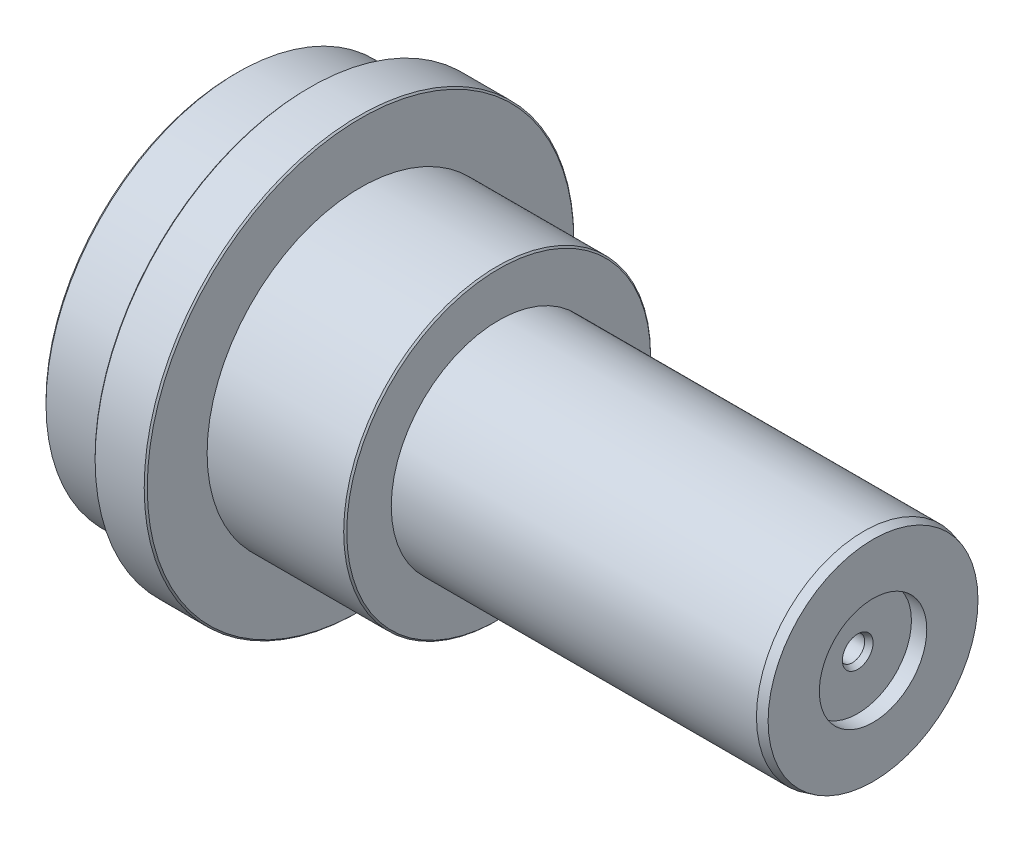
ISO-10303-21;
HEADER;
FILE_DESCRIPTION(('STEP AP214'),'2;1');
FILE_NAME('part.step','',(''),(''),'','','');
FILE_SCHEMA(('AUTOMOTIVE_DESIGN { 1 0 10303 214 1 1 1 1 }'));
ENDSEC;
DATA;
#1=APPLICATION_CONTEXT('core data for automotive mechanical design processes');
#2=APPLICATION_PROTOCOL_DEFINITION('international standard','automotive_design',2000,#1);
#3=PRODUCT_CONTEXT('',#1,'mechanical');
#4=PRODUCT('Part','Part','',(#3));
#5=PRODUCT_RELATED_PRODUCT_CATEGORY('part','',(#4));
#6=PRODUCT_DEFINITION_FORMATION('','',#4);
#7=PRODUCT_DEFINITION_CONTEXT('part definition',#1,'design');
#8=PRODUCT_DEFINITION('design','',#6,#7);
#9=PRODUCT_DEFINITION_SHAPE('','',#8);
#10=(LENGTH_UNIT() NAMED_UNIT(*) SI_UNIT(.MILLI.,.METRE.));
#11=(NAMED_UNIT(*) PLANE_ANGLE_UNIT() SI_UNIT($,.RADIAN.));
#12=(NAMED_UNIT(*) SI_UNIT($,.STERADIAN.) SOLID_ANGLE_UNIT());
#13=UNCERTAINTY_MEASURE_WITH_UNIT(LENGTH_MEASURE(1.E-05),#10,'distance_accuracy_value','');
#14=(GEOMETRIC_REPRESENTATION_CONTEXT(3) GLOBAL_UNCERTAINTY_ASSIGNED_CONTEXT((#13)) GLOBAL_UNIT_ASSIGNED_CONTEXT((#10,
#11,#12)) REPRESENTATION_CONTEXT('',''));
#15=CARTESIAN_POINT('',(0.,0.,0.));
#16=DIRECTION('',(0.,0.,1.));
#17=DIRECTION('',(1.,0.,0.));
#18=AXIS2_PLACEMENT_3D('',#15,#16,#17);
#19=CARTESIAN_POINT('',(41.,0.,0.));
#20=DIRECTION('',(-1.,0.,0.));
#21=DIRECTION('',(0.,0.,1.));
#22=AXIS2_PLACEMENT_3D('',#19,#20,#21);
#23=CYLINDRICAL_SURFACE('',#22,70.);
#24=CARTESIAN_POINT('',(40.4999999995512,0.,0.));
#25=DIRECTION('',(1.,0.,0.));
#26=DIRECTION('',(0.,0.,-1.));
#27=AXIS2_PLACEMENT_3D('',#24,#25,#26);
#28=CIRCLE('',#27,70.);
#29=CARTESIAN_POINT('',(40.4999999995512,0.,-70.));
#30=VERTEX_POINT('',#29);
#31=EDGE_CURVE('E112',#30,#30,#28,.F.);
#32=ORIENTED_EDGE('',*,*,#31,.T.);
#33=EDGE_LOOP('',(#32));
#34=FACE_BOUND('',#33,.T.);
#35=CARTESIAN_POINT('',(24.4999999995513,0.,0.));
#36=DIRECTION('',(-1.,0.,0.));
#37=DIRECTION('',(0.,0.,1.));
#38=AXIS2_PLACEMENT_3D('',#35,#36,#37);
#39=CIRCLE('',#38,70.);
#40=CARTESIAN_POINT('',(24.4999999995513,0.,70.));
#41=VERTEX_POINT('',#40);
#42=EDGE_CURVE('E109',#41,#41,#39,.F.);
#43=ORIENTED_EDGE('',*,*,#42,.T.);
#44=EDGE_LOOP('',(#43));
#45=FACE_BOUND('',#44,.T.);
#46=ADVANCED_FACE('F41',(#34,#45),#23,.T.);
#47=CARTESIAN_POINT('',(41.,70.,0.));
#48=DIRECTION('',(1.,0.,0.));
#49=DIRECTION('',(0.,0.,-1.));
#50=AXIS2_PLACEMENT_3D('',#47,#48,#49);
#51=PLANE('',#50);
#52=CARTESIAN_POINT('',(41.,0.,0.));
#53=DIRECTION('',(1.,0.,0.));
#54=DIRECTION('',(0.,0.,-1.));
#55=AXIS2_PLACEMENT_3D('',#52,#53,#54);
#56=CIRCLE('',#55,69.5000000004487);
#57=CARTESIAN_POINT('',(41.,0.,-69.5000000004487));
#58=VERTEX_POINT('',#57);
#59=EDGE_CURVE('E115',#58,#58,#56,.T.);
#60=ORIENTED_EDGE('',*,*,#59,.T.);
#61=EDGE_LOOP('',(#60));
#62=FACE_BOUND('',#61,.T.);
#63=CARTESIAN_POINT('',(41.,0.,0.));
#64=DIRECTION('',(1.,0.,0.));
#65=DIRECTION('',(0.,0.,-1.));
#66=AXIS2_PLACEMENT_3D('',#63,#64,#65);
#67=CIRCLE('',#66,50.);
#68=CARTESIAN_POINT('',(41.,0.,50.));
#69=VERTEX_POINT('',#68);
#70=EDGE_CURVE('E87',#69,#69,#67,.T.);
#71=ORIENTED_EDGE('',*,*,#70,.F.);
#72=EDGE_LOOP('',(#71));
#73=FACE_BOUND('',#72,.T.);
#74=ADVANCED_FACE('F142',(#62,#73),#51,.T.);
#75=CARTESIAN_POINT('',(24.,0.,0.));
#76=DIRECTION('',(-1.,0.,0.));
#77=DIRECTION('',(0.,0.,1.));
#78=AXIS2_PLACEMENT_3D('',#75,#76,#77);
#79=PLANE('',#78);
#80=CARTESIAN_POINT('',(24.,0.,0.));
#81=DIRECTION('',(-1.,0.,0.));
#82=DIRECTION('',(0.,0.,1.));
#83=AXIS2_PLACEMENT_3D('',#80,#81,#82);
#84=CIRCLE('',#83,69.4999999995512);
#85=CARTESIAN_POINT('',(24.,0.,69.4999999995512));
#86=VERTEX_POINT('',#85);
#87=EDGE_CURVE('E124',#86,#86,#84,.T.);
#88=ORIENTED_EDGE('',*,*,#87,.T.);
#89=EDGE_LOOP('',(#88));
#90=FACE_BOUND('',#89,.T.);
#91=CARTESIAN_POINT('',(24.,0.,0.));
#92=DIRECTION('',(-1.,0.,0.));
#93=DIRECTION('',(0.,0.,1.));
#94=AXIS2_PLACEMENT_3D('',#91,#92,#93);
#95=CIRCLE('',#94,62.5);
#96=CARTESIAN_POINT('',(24.,0.,62.5));
#97=VERTEX_POINT('',#96);
#98=EDGE_CURVE('E82',#97,#97,#95,.T.);
#99=ORIENTED_EDGE('',*,*,#98,.F.);
#100=EDGE_LOOP('',(#99));
#101=FACE_BOUND('',#100,.T.);
#102=ADVANCED_FACE('F148',(#90,#101),#79,.T.);
#103=CARTESIAN_POINT('',(0.,0.,0.));
#104=DIRECTION('',(1.,0.,0.));
#105=DIRECTION('',(0.,0.,-1.));
#106=AXIS2_PLACEMENT_3D('',#103,#104,#105);
#107=CYLINDRICAL_SURFACE('',#106,62.5);
#108=CARTESIAN_POINT('',(0.999999999102629,0.,0.));
#109=DIRECTION('',(-1.,0.,0.));
#110=DIRECTION('',(0.,0.,1.));
#111=AXIS2_PLACEMENT_3D('',#108,#109,#110);
#112=CIRCLE('',#111,62.5);
#113=CARTESIAN_POINT('',(0.999999999102652,0.,62.5));
#114=VERTEX_POINT('',#113);
#115=EDGE_CURVE('E11',#114,#114,#112,.F.);
#116=ORIENTED_EDGE('',*,*,#115,.T.);
#117=EDGE_LOOP('',(#116));
#118=FACE_BOUND('',#117,.T.);
#119=ORIENTED_EDGE('',*,*,#98,.T.);
#120=EDGE_LOOP('',(#119));
#121=FACE_BOUND('',#120,.T.);
#122=ADVANCED_FACE('F224',(#118,#121),#107,.T.);
#123=CARTESIAN_POINT('',(0.,0.,0.));
#124=DIRECTION('',(-1.,0.,0.));
#125=DIRECTION('',(0.,0.,1.));
#126=AXIS2_PLACEMENT_3D('',#123,#124,#125);
#127=PLANE('',#126);
#128=CARTESIAN_POINT('',(0.,0.,0.));
#129=DIRECTION('',(-1.,0.,0.));
#130=DIRECTION('',(0.,0.,1.));
#131=AXIS2_PLACEMENT_3D('',#128,#129,#130);
#132=CIRCLE('',#131,61.4999999991025);
#133=CARTESIAN_POINT('',(0.,0.,61.4999999991025));
#134=VERTEX_POINT('',#133);
#135=EDGE_CURVE('E50',#134,#134,#132,.T.);
#136=ORIENTED_EDGE('',*,*,#135,.T.);
#137=EDGE_LOOP('',(#136));
#138=FACE_BOUND('',#137,.T.);
#139=CARTESIAN_POINT('',(0.,0.,0.));
#140=DIRECTION('',(-1.,0.,0.));
#141=DIRECTION('',(0.,0.,1.));
#142=AXIS2_PLACEMENT_3D('',#139,#140,#141);
#143=CIRCLE('',#142,12.5);
#144=CARTESIAN_POINT('',(0.,0.,12.5));
#145=VERTEX_POINT('',#144);
#146=EDGE_CURVE('E73',#145,#145,#143,.T.);
#147=ORIENTED_EDGE('',*,*,#146,.F.);
#148=EDGE_LOOP('',(#147));
#149=FACE_BOUND('',#148,.T.);
#150=ADVANCED_FACE('F129',(#138,#149),#127,.T.);
#151=CARTESIAN_POINT('',(86.,0.,0.));
#152=DIRECTION('',(-1.,0.,0.));
#153=DIRECTION('',(0.,0.,1.));
#154=AXIS2_PLACEMENT_3D('',#151,#152,#153);
#155=CYLINDRICAL_SURFACE('',#154,50.);
#156=CARTESIAN_POINT('',(85.5000000004489,0.,0.));
#157=DIRECTION('',(1.,0.,0.));
#158=DIRECTION('',(0.,0.,-1.));
#159=AXIS2_PLACEMENT_3D('',#156,#157,#158);
#160=CIRCLE('',#159,50.);
#161=CARTESIAN_POINT('',(85.5000000004489,0.,50.));
#162=VERTEX_POINT('',#161);
#163=EDGE_CURVE('E121',#162,#162,#160,.F.);
#164=CARTESIAN_POINT('',(85.5000000004489,0.,50.));
#165=CARTESIAN_POINT('',(85.0364583337776,0.,50.));
#166=CARTESIAN_POINT('',(84.5729166671062,0.,50.));
#167=CARTESIAN_POINT('',(83.6458333337635,0.,50.));
#168=CARTESIAN_POINT('',(83.1822916670922,0.,50.));
#169=CARTESIAN_POINT('',(82.2552083337495,0.,50.));
#170=CARTESIAN_POINT('',(81.7916666670782,0.,50.));
#171=CARTESIAN_POINT('',(80.8645833337355,0.,50.));
#172=CARTESIAN_POINT('',(80.4010416670641,0.,50.));
#173=CARTESIAN_POINT('',(79.4739583337214,0.,50.));
#174=CARTESIAN_POINT('',(79.0104166670501,0.,50.));
#175=CARTESIAN_POINT('',(78.0833333337074,0.,50.));
#176=CARTESIAN_POINT('',(77.6197916670361,0.,50.));
#177=CARTESIAN_POINT('',(76.6927083336934,0.,50.));
#178=CARTESIAN_POINT('',(76.229166667022,0.,50.));
#179=CARTESIAN_POINT('',(75.3020833336793,0.,50.));
#180=CARTESIAN_POINT('',(74.838541667008,0.,50.));
#181=CARTESIAN_POINT('',(73.9114583336653,0.,50.));
#182=CARTESIAN_POINT('',(73.447916666994,0.,50.));
#183=CARTESIAN_POINT('',(72.5208333336513,0.,50.));
#184=CARTESIAN_POINT('',(72.0572916669799,0.,50.));
#185=CARTESIAN_POINT('',(71.1302083336373,0.,50.));
#186=CARTESIAN_POINT('',(70.6666666669659,0.,50.));
#187=CARTESIAN_POINT('',(69.7395833336232,0.,50.));
#188=CARTESIAN_POINT('',(69.2760416669519,0.,50.));
#189=CARTESIAN_POINT('',(68.3489583336092,0.,50.));
#190=CARTESIAN_POINT('',(67.8854166669379,0.,50.));
#191=CARTESIAN_POINT('',(66.9583333335952,0.,50.));
#192=CARTESIAN_POINT('',(66.4947916669238,0.,50.));
#193=CARTESIAN_POINT('',(65.5677083335812,0.,50.));
#194=CARTESIAN_POINT('',(65.1041666669098,0.,50.));
#195=CARTESIAN_POINT('',(64.1770833335671,0.,50.));
#196=CARTESIAN_POINT('',(63.7135416668958,0.,50.));
#197=CARTESIAN_POINT('',(62.7864583335531,0.,50.));
#198=CARTESIAN_POINT('',(62.3229166668818,0.,50.));
#199=CARTESIAN_POINT('',(61.3958333335391,0.,50.));
#200=CARTESIAN_POINT('',(60.9322916668677,0.,50.));
#201=CARTESIAN_POINT('',(60.0052083335251,0.,50.));
#202=CARTESIAN_POINT('',(59.5416666668537,0.,50.));
#203=CARTESIAN_POINT('',(58.614583333511,0.,50.));
#204=CARTESIAN_POINT('',(58.1510416668397,0.,50.));
#205=CARTESIAN_POINT('',(57.223958333497,0.,50.));
#206=CARTESIAN_POINT('',(56.7604166668257,0.,50.));
#207=CARTESIAN_POINT('',(55.833333333483,0.,50.));
#208=CARTESIAN_POINT('',(55.3697916668116,0.,50.));
#209=CARTESIAN_POINT('',(54.4427083334689,0.,50.));
#210=CARTESIAN_POINT('',(53.9791666667976,0.,50.));
#211=CARTESIAN_POINT('',(53.0520833334549,0.,50.));
#212=CARTESIAN_POINT('',(52.5885416667836,0.,50.));
#213=CARTESIAN_POINT('',(51.6614583334409,0.,50.));
#214=CARTESIAN_POINT('',(51.1979166667696,0.,50.));
#215=CARTESIAN_POINT('',(50.2708333334269,0.,50.));
#216=CARTESIAN_POINT('',(49.8072916667555,0.,50.));
#217=CARTESIAN_POINT('',(48.8802083334128,0.,50.));
#218=CARTESIAN_POINT('',(48.4166666667415,0.,50.));
#219=CARTESIAN_POINT('',(47.4895833333988,0.,50.));
#220=CARTESIAN_POINT('',(47.0260416667275,0.,50.));
#221=CARTESIAN_POINT('',(46.0989583333848,0.,50.));
#222=CARTESIAN_POINT('',(45.6354166667134,0.,50.));
#223=CARTESIAN_POINT('',(44.7083333333708,0.,50.));
#224=CARTESIAN_POINT('',(44.2447916666994,0.,50.));
#225=CARTESIAN_POINT('',(43.3177083333567,0.,50.));
#226=CARTESIAN_POINT('',(42.8541666666854,0.,50.));
#227=CARTESIAN_POINT('',(41.9270833333427,0.,50.));
#228=CARTESIAN_POINT('',(41.4635416666714,0.,50.));
#229=CARTESIAN_POINT('',(41.,0.,50.));
#230=B_SPLINE_CURVE_WITH_KNOTS('',3,(#164,#165,#166,#167,#168,#169,#170,#171,#172,#173,#174,
#175,#176,#177,#178,#179,#180,#181,#182,#183,#184,#185,#186,#187,#188,#189,#190,#191,#192,#193,
#194,#195,#196,#197,#198,#199,#200,#201,#202,#203,#204,#205,#206,#207,#208,#209,#210,#211,#212,
#213,#214,#215,#216,#217,#218,#219,#220,#221,#222,#223,#224,#225,#226,#227,#228,#229),
.UNSPECIFIED.,.F.,.F.,(4,2,2,2,2,2,2,2,2,2,2,2,2,2,2,2,2,2,2,2,2,2,2,2,2,2,2,2,2,2,2,2,4),(0.,
1.39062500001404,2.78125000002806,4.17187500004208,5.56250000005612,6.95312500007014,
8.34375000008417,9.7343750000982,11.1250000001122,12.5156250001262,13.9062500001403,
15.2968750001543,16.6875000001683,18.0781250001824,19.4687500001964,20.8593750002104,
22.2500000002244,23.6406250002385,25.0312500002525,26.4218750002665,27.8125000002806,
29.2031250002946,30.5937500003086,31.9843750003226,33.3750000003367,34.7656250003507,
36.1562500003647,37.5468750003787,38.9375000003928,40.3281250004068,41.7187500004208,
43.1093750004349,44.5000000004489),.UNSPECIFIED.);
#231=EDGE_CURVE('BSEAM203',#162,#69,#230,.T.);
#232=ORIENTED_EDGE('',*,*,#163,.T.);
#233=ORIENTED_EDGE('',*,*,#70,.T.);
#234=ORIENTED_EDGE('',*,*,#231,.T.);
#235=ORIENTED_EDGE('',*,*,#231,.F.);
#236=EDGE_LOOP('',(#232,#234,#233,#235));
#237=FACE_BOUND('',#236,.T.);
#238=ADVANCED_FACE('F203',(#237),#155,.T.);
#239=CARTESIAN_POINT('',(86.,0.,0.));
#240=DIRECTION('',(1.,0.,0.));
#241=DIRECTION('',(0.,0.,-1.));
#242=AXIS2_PLACEMENT_3D('',#239,#240,#241);
#243=PLANE('',#242);
#244=CARTESIAN_POINT('',(86.,0.,0.));
#245=DIRECTION('',(1.,0.,0.));
#246=DIRECTION('',(0.,0.,-1.));
#247=AXIS2_PLACEMENT_3D('',#244,#245,#246);
#248=CIRCLE('',#247,49.4999999995514);
#249=CARTESIAN_POINT('',(86.,0.,-49.4999999995514));
#250=VERTEX_POINT('',#249);
#251=EDGE_CURVE('E118',#250,#250,#248,.T.);
#252=ORIENTED_EDGE('',*,*,#251,.T.);
#253=EDGE_LOOP('',(#252));
#254=FACE_BOUND('',#253,.T.);
#255=CARTESIAN_POINT('',(86.,0.,0.));
#256=DIRECTION('',(1.,0.,0.));
#257=DIRECTION('',(0.,0.,-1.));
#258=AXIS2_PLACEMENT_3D('',#255,#256,#257);
#259=CIRCLE('',#258,35.);
#260=CARTESIAN_POINT('',(86.,0.,35.));
#261=VERTEX_POINT('',#260);
#262=EDGE_CURVE('E83',#261,#261,#259,.T.);
#263=ORIENTED_EDGE('',*,*,#262,.F.);
#264=EDGE_LOOP('',(#263));
#265=FACE_BOUND('',#264,.T.);
#266=ADVANCED_FACE('F199',(#254,#265),#243,.T.);
#267=CARTESIAN_POINT('',(208.,0.,0.));
#268=DIRECTION('',(-1.,0.,0.));
#269=DIRECTION('',(0.,0.,1.));
#270=AXIS2_PLACEMENT_3D('',#267,#268,#269);
#271=CYLINDRICAL_SURFACE('',#270,35.);
#272=CARTESIAN_POINT('',(204.999999999758,0.,0.));
#273=DIRECTION('',(1.,0.,0.));
#274=DIRECTION('',(0.,0.,-1.));
#275=AXIS2_PLACEMENT_3D('',#272,#273,#274);
#276=CIRCLE('',#275,35.);
#277=CARTESIAN_POINT('',(204.999999999759,0.,35.));
#278=VERTEX_POINT('',#277);
#279=EDGE_CURVE('E94',#278,#278,#276,.F.);
#280=CARTESIAN_POINT('',(204.999999999759,0.,35.));
#281=CARTESIAN_POINT('',(203.760416666428,0.,35.));
#282=CARTESIAN_POINT('',(202.520833333097,0.,35.));
#283=CARTESIAN_POINT('',(200.041666666435,0.,35.));
#284=CARTESIAN_POINT('',(198.802083333104,0.,35.));
#285=CARTESIAN_POINT('',(196.322916666443,0.,35.));
#286=CARTESIAN_POINT('',(195.083333333112,0.,35.));
#287=CARTESIAN_POINT('',(192.60416666645,0.,35.));
#288=CARTESIAN_POINT('',(191.364583333119,0.,35.));
#289=CARTESIAN_POINT('',(188.885416666458,0.,35.));
#290=CARTESIAN_POINT('',(187.645833333127,0.,35.));
#291=CARTESIAN_POINT('',(185.166666666465,0.,35.));
#292=CARTESIAN_POINT('',(183.927083333135,0.,35.));
#293=CARTESIAN_POINT('',(181.447916666473,0.,35.));
#294=CARTESIAN_POINT('',(180.208333333142,0.,35.));
#295=CARTESIAN_POINT('',(177.72916666648,0.,35.));
#296=CARTESIAN_POINT('',(176.48958333315,0.,35.));
#297=CARTESIAN_POINT('',(174.010416666488,0.,35.));
#298=CARTESIAN_POINT('',(172.770833333157,0.,35.));
#299=CARTESIAN_POINT('',(170.291666666496,0.,35.));
#300=CARTESIAN_POINT('',(169.052083333165,0.,35.));
#301=CARTESIAN_POINT('',(166.572916666503,0.,35.));
#302=CARTESIAN_POINT('',(165.333333333172,0.,35.));
#303=CARTESIAN_POINT('',(162.854166666511,0.,35.));
#304=CARTESIAN_POINT('',(161.61458333318,0.,35.));
#305=CARTESIAN_POINT('',(159.135416666518,0.,35.));
#306=CARTESIAN_POINT('',(157.895833333187,0.,35.));
#307=CARTESIAN_POINT('',(155.416666666526,0.,35.));
#308=CARTESIAN_POINT('',(154.177083333195,0.,35.));
#309=CARTESIAN_POINT('',(151.697916666533,0.,35.));
#310=CARTESIAN_POINT('',(150.458333333203,0.,35.));
#311=CARTESIAN_POINT('',(147.979166666541,0.,35.));
#312=CARTESIAN_POINT('',(146.73958333321,0.,35.));
#313=CARTESIAN_POINT('',(144.260416666548,0.,35.));
#314=CARTESIAN_POINT('',(143.020833333218,0.,35.));
#315=CARTESIAN_POINT('',(140.541666666556,0.,35.));
#316=CARTESIAN_POINT('',(139.302083333225,0.,35.));
#317=CARTESIAN_POINT('',(136.822916666564,0.,35.));
#318=CARTESIAN_POINT('',(135.583333333233,0.,35.));
#319=CARTESIAN_POINT('',(133.104166666571,0.,35.));
#320=CARTESIAN_POINT('',(131.86458333324,0.,35.));
#321=CARTESIAN_POINT('',(129.385416666579,0.,35.));
#322=CARTESIAN_POINT('',(128.145833333248,0.,35.));
#323=CARTESIAN_POINT('',(125.666666666586,0.,35.));
#324=CARTESIAN_POINT('',(124.427083333255,0.,35.));
#325=CARTESIAN_POINT('',(121.947916666594,0.,35.));
#326=CARTESIAN_POINT('',(120.708333333263,0.,35.));
#327=CARTESIAN_POINT('',(118.229166666601,0.,35.));
#328=CARTESIAN_POINT('',(116.98958333327,0.,35.));
#329=CARTESIAN_POINT('',(114.510416666609,0.,35.));
#330=CARTESIAN_POINT('',(113.270833333278,0.,35.));
#331=CARTESIAN_POINT('',(110.791666666616,0.,35.));
#332=CARTESIAN_POINT('',(109.552083333286,0.,35.));
#333=CARTESIAN_POINT('',(107.072916666624,0.,35.));
#334=CARTESIAN_POINT('',(105.833333333293,0.,35.));
#335=CARTESIAN_POINT('',(103.354166666631,0.,35.));
#336=CARTESIAN_POINT('',(102.114583333301,0.,35.));
#337=CARTESIAN_POINT('',(99.635416666639,0.,35.));
#338=CARTESIAN_POINT('',(98.3958333333082,0.,35.));
#339=CARTESIAN_POINT('',(95.9166666666465,0.,35.));
#340=CARTESIAN_POINT('',(94.6770833333157,0.,35.));
#341=CARTESIAN_POINT('',(92.1979166666541,0.,35.));
#342=CARTESIAN_POINT('',(90.9583333333233,0.,35.));
#343=CARTESIAN_POINT('',(88.4791666666616,0.,35.));
#344=CARTESIAN_POINT('',(87.2395833333308,0.,35.));
#345=CARTESIAN_POINT('',(86.,0.,35.));
#346=B_SPLINE_CURVE_WITH_KNOTS('',3,(#280,#281,#282,#283,#284,#285,#286,#287,#288,#289,#290,
#291,#292,#293,#294,#295,#296,#297,#298,#299,#300,#301,#302,#303,#304,#305,#306,#307,#308,#309,
#310,#311,#312,#313,#314,#315,#316,#317,#318,#319,#320,#321,#322,#323,#324,#325,#326,#327,#328,
#329,#330,#331,#332,#333,#334,#335,#336,#337,#338,#339,#340,#341,#342,#343,#344,#345),
.UNSPECIFIED.,.F.,.F.,(4,2,2,2,2,2,2,2,2,2,2,2,2,2,2,2,2,2,2,2,2,2,2,2,2,2,2,2,2,2,2,2,4),(0.,
3.71874999999247,7.43749999998491,11.1562499999774,14.8749999999698,18.5937499999623,
22.3124999999547,26.0312499999472,29.7499999999396,33.4687499999321,37.1874999999245,
40.906249999917,44.6249999999095,48.3437499999019,52.0624999998943,55.7812499998868,
59.4999999998792,63.2187499998717,66.9374999998642,70.6562499998566,74.3749999998491,
78.0937499998415,81.812499999834,85.5312499998264,89.2499999998189,92.9687499998113,
96.6874999998038,100.406249999796,104.124999999789,107.843749999781,111.562499999774,
115.281249999766,118.999999999759),.UNSPECIFIED.);
#347=EDGE_CURVE('BSEAM202',#278,#261,#346,.T.);
#348=ORIENTED_EDGE('',*,*,#279,.T.);
#349=ORIENTED_EDGE('',*,*,#262,.T.);
#350=ORIENTED_EDGE('',*,*,#347,.T.);
#351=ORIENTED_EDGE('',*,*,#347,.F.);
#352=EDGE_LOOP('',(#348,#350,#349,#351));
#353=FACE_BOUND('',#352,.T.);
#354=ADVANCED_FACE('F202',(#353),#271,.T.);
#355=CARTESIAN_POINT('',(208.,0.,0.));
#356=DIRECTION('',(1.,0.,0.));
#357=DIRECTION('',(0.,0.,-1.));
#358=AXIS2_PLACEMENT_3D('',#355,#356,#357);
#359=PLANE('',#358);
#360=CARTESIAN_POINT('',(208.,0.,0.));
#361=DIRECTION('',(1.,0.,0.));
#362=DIRECTION('',(0.,0.,-1.));
#363=AXIS2_PLACEMENT_3D('',#360,#361,#362);
#364=CIRCLE('',#363,34.1961524236038);
#365=CARTESIAN_POINT('',(208.,0.,-34.1961524236038));
#366=VERTEX_POINT('',#365);
#367=EDGE_CURVE('E86',#366,#366,#364,.T.);
#368=ORIENTED_EDGE('',*,*,#367,.T.);
#369=EDGE_LOOP('',(#368));
#370=FACE_BOUND('',#369,.T.);
#371=CARTESIAN_POINT('',(208.,0.,0.));
#372=DIRECTION('',(1.,0.,0.));
#373=DIRECTION('',(0.,0.,-1.));
#374=AXIS2_PLACEMENT_3D('',#371,#372,#373);
#375=CIRCLE('',#374,17.5);
#376=CARTESIAN_POINT('',(208.,0.,-17.5));
#377=VERTEX_POINT('',#376);
#378=EDGE_CURVE('E66',#377,#377,#375,.T.);
#379=ORIENTED_EDGE('',*,*,#378,.F.);
#380=EDGE_LOOP('',(#379));
#381=FACE_BOUND('',#380,.T.);
#382=ADVANCED_FACE('F208',(#370,#381),#359,.T.);
#383=CARTESIAN_POINT('',(193.,0.,0.));
#384=DIRECTION('',(1.,0.,0.));
#385=DIRECTION('',(0.,0.,-1.));
#386=AXIS2_PLACEMENT_3D('',#383,#384,#385);
#387=CONICAL_SURFACE('',#386,4.,1.02974425749014);
#388=CARTESIAN_POINT('',(190.59655751743,0.,0.));
#389=VERTEX_POINT('',#388);
#390=VERTEX_LOOP('',#389);
#391=FACE_BOUND('',#390,.T.);
#392=CARTESIAN_POINT('',(193.,0.,0.));
#393=DIRECTION('',(1.,0.,0.));
#394=DIRECTION('',(0.,0.,-1.));
#395=AXIS2_PLACEMENT_3D('',#392,#393,#394);
#396=CIRCLE('',#395,4.);
#397=CARTESIAN_POINT('',(193.,0.,-3.99999999999999));
#398=VERTEX_POINT('',#397);
#399=EDGE_CURVE('E79',#398,#398,#396,.T.);
#400=ORIENTED_EDGE('',*,*,#399,.T.);
#401=EDGE_LOOP('',(#400));
#402=FACE_BOUND('',#401,.T.);
#403=ADVANCED_FACE('F214',(#391,#402),#387,.F.);
#404=CARTESIAN_POINT('',(208.,0.,0.));
#405=DIRECTION('',(1.,0.,0.));
#406=DIRECTION('',(0.,0.,-1.));
#407=AXIS2_PLACEMENT_3D('',#404,#405,#406);
#408=CYLINDRICAL_SURFACE('',#407,4.);
#409=CARTESIAN_POINT('',(201.26794919187,0.,0.));
#410=DIRECTION('',(-1.,0.,0.));
#411=DIRECTION('',(0.,0.,1.));
#412=AXIS2_PLACEMENT_3D('',#409,#410,#411);
#413=CIRCLE('',#412,4.);
#414=CARTESIAN_POINT('',(201.26794919187,0.,4.));
#415=VERTEX_POINT('',#414);
#416=EDGE_CURVE('E103',#415,#415,#413,.F.);
#417=ORIENTED_EDGE('',*,*,#416,.T.);
#418=EDGE_LOOP('',(#417));
#419=FACE_BOUND('',#418,.T.);
#420=ORIENTED_EDGE('',*,*,#399,.F.);
#421=EDGE_LOOP('',(#420));
#422=FACE_BOUND('',#421,.T.);
#423=ADVANCED_FACE('F332',(#419,#422),#408,.F.);
#424=CARTESIAN_POINT('',(203.,4.,0.));
#425=DIRECTION('',(-1.,0.,0.));
#426=DIRECTION('',(0.,0.,1.));
#427=AXIS2_PLACEMENT_3D('',#424,#425,#426);
#428=PLANE('',#427);
#429=CARTESIAN_POINT('',(203.,0.,0.));
#430=DIRECTION('',(-1.,0.,0.));
#431=DIRECTION('',(0.,0.,1.));
#432=AXIS2_PLACEMENT_3D('',#429,#430,#431);
#433=CIRCLE('',#432,4.99999999895334);
#434=CARTESIAN_POINT('',(203.,0.,4.99999999895335));
#435=VERTEX_POINT('',#434);
#436=EDGE_CURVE('E106',#435,#435,#433,.T.);
#437=ORIENTED_EDGE('',*,*,#436,.T.);
#438=EDGE_LOOP('',(#437));
#439=FACE_BOUND('',#438,.T.);
#440=CARTESIAN_POINT('',(203.,0.,0.));
#441=DIRECTION('',(1.,0.,0.));
#442=DIRECTION('',(0.,0.,-1.));
#443=AXIS2_PLACEMENT_3D('',#440,#441,#442);
#444=CIRCLE('',#443,17.5);
#445=CARTESIAN_POINT('',(203.,0.,-17.5));
#446=VERTEX_POINT('',#445);
#447=EDGE_CURVE('E70',#446,#446,#444,.T.);
#448=ORIENTED_EDGE('',*,*,#447,.T.);
#449=EDGE_LOOP('',(#448));
#450=FACE_BOUND('',#449,.T.);
#451=ADVANCED_FACE('F324',(#439,#450),#428,.F.);
#452=CARTESIAN_POINT('',(208.,0.,0.));
#453=DIRECTION('',(1.,0.,0.));
#454=DIRECTION('',(0.,0.,-1.));
#455=AXIS2_PLACEMENT_3D('',#452,#453,#454);
#456=CYLINDRICAL_SURFACE('',#455,17.5);
#457=ORIENTED_EDGE('',*,*,#447,.F.);
#458=EDGE_LOOP('',(#457));
#459=FACE_BOUND('',#458,.T.);
#460=ORIENTED_EDGE('',*,*,#378,.T.);
#461=EDGE_LOOP('',(#460));
#462=FACE_BOUND('',#461,.T.);
#463=ADVANCED_FACE('F60',(#459,#462),#456,.F.);
#464=CARTESIAN_POINT('',(12.,0.,0.));
#465=DIRECTION('',(-1.,0.,0.));
#466=DIRECTION('',(0.,0.,1.));
#467=AXIS2_PLACEMENT_3D('',#464,#465,#466);
#468=CONICAL_SURFACE('',#467,4.,1.02974425748804);
#469=CARTESIAN_POINT('',(14.4034424825812,0.,0.));
#470=VERTEX_POINT('',#469);
#471=VERTEX_LOOP('',#470);
#472=FACE_BOUND('',#471,.T.);
#473=CARTESIAN_POINT('',(12.,0.,0.));
#474=DIRECTION('',(-1.,0.,0.));
#475=DIRECTION('',(0.,0.,1.));
#476=AXIS2_PLACEMENT_3D('',#473,#474,#475);
#477=CIRCLE('',#476,4.);
#478=CARTESIAN_POINT('',(12.,0.,4.));
#479=VERTEX_POINT('',#478);
#480=EDGE_CURVE('E64',#479,#479,#477,.T.);
#481=ORIENTED_EDGE('',*,*,#480,.T.);
#482=EDGE_LOOP('',(#481));
#483=FACE_BOUND('',#482,.T.);
#484=ADVANCED_FACE('F56',(#472,#483),#468,.F.);
#485=CARTESIAN_POINT('',(0.,0.,0.));
#486=DIRECTION('',(-1.,0.,0.));
#487=DIRECTION('',(0.,0.,1.));
#488=AXIS2_PLACEMENT_3D('',#485,#486,#487);
#489=CYLINDRICAL_SURFACE('',#488,4.);
#490=CARTESIAN_POINT('',(3.73205080812997,0.,0.));
#491=DIRECTION('',(1.,0.,0.));
#492=DIRECTION('',(0.,0.,-1.));
#493=AXIS2_PLACEMENT_3D('',#490,#491,#492);
#494=CIRCLE('',#493,4.);
#495=CARTESIAN_POINT('',(3.73205080812996,0.,-4.));
#496=VERTEX_POINT('',#495);
#497=EDGE_CURVE('E97',#496,#496,#494,.F.);
#498=ORIENTED_EDGE('',*,*,#497,.T.);
#499=EDGE_LOOP('',(#498));
#500=FACE_BOUND('',#499,.T.);
#501=ORIENTED_EDGE('',*,*,#480,.F.);
#502=EDGE_LOOP('',(#501));
#503=FACE_BOUND('',#502,.T.);
#504=ADVANCED_FACE('F59',(#500,#503),#489,.F.);
#505=CARTESIAN_POINT('',(2.00000000000001,4.,0.));
#506=DIRECTION('',(1.,0.,0.));
#507=DIRECTION('',(0.,0.,-1.));
#508=AXIS2_PLACEMENT_3D('',#505,#506,#507);
#509=PLANE('',#508);
#510=CARTESIAN_POINT('',(2.00000000000001,0.,0.));
#511=DIRECTION('',(1.,0.,0.));
#512=DIRECTION('',(0.,0.,-1.));
#513=AXIS2_PLACEMENT_3D('',#510,#511,#512);
#514=CIRCLE('',#513,4.99999999895329);
#515=CARTESIAN_POINT('',(2.,0.,-4.99999999895329));
#516=VERTEX_POINT('',#515);
#517=EDGE_CURVE('E100',#516,#516,#514,.T.);
#518=ORIENTED_EDGE('',*,*,#517,.T.);
#519=EDGE_LOOP('',(#518));
#520=FACE_BOUND('',#519,.T.);
#521=CARTESIAN_POINT('',(2.,0.,0.));
#522=DIRECTION('',(-1.,0.,0.));
#523=DIRECTION('',(0.,0.,1.));
#524=AXIS2_PLACEMENT_3D('',#521,#522,#523);
#525=CIRCLE('',#524,12.5);
#526=CARTESIAN_POINT('',(2.00000000000001,0.,12.5));
#527=VERTEX_POINT('',#526);
#528=EDGE_CURVE('E67',#527,#527,#525,.T.);
#529=ORIENTED_EDGE('',*,*,#528,.T.);
#530=EDGE_LOOP('',(#529));
#531=FACE_BOUND('',#530,.T.);
#532=ADVANCED_FACE('F298',(#520,#531),#509,.F.);
#533=CARTESIAN_POINT('',(0.,0.,0.));
#534=DIRECTION('',(-1.,0.,0.));
#535=DIRECTION('',(0.,0.,1.));
#536=AXIS2_PLACEMENT_3D('',#533,#534,#535);
#537=CYLINDRICAL_SURFACE('',#536,12.5);
#538=ORIENTED_EDGE('',*,*,#528,.F.);
#539=EDGE_LOOP('',(#538));
#540=FACE_BOUND('',#539,.T.);
#541=ORIENTED_EDGE('',*,*,#146,.T.);
#542=EDGE_LOOP('',(#541));
#543=FACE_BOUND('',#542,.T.);
#544=ADVANCED_FACE('F162',(#540,#543),#537,.F.);
#545=CARTESIAN_POINT('',(208.,0.,0.));
#546=DIRECTION('',(-1.,0.,0.));
#547=DIRECTION('',(0.,0.,1.));
#548=AXIS2_PLACEMENT_3D('',#545,#546,#547);
#549=CONICAL_SURFACE('',#548,34.1961524236038,0.261799387500003);
#550=ORIENTED_EDGE('',*,*,#279,.F.);
#551=EDGE_LOOP('',(#550));
#552=FACE_BOUND('',#551,.T.);
#553=ORIENTED_EDGE('',*,*,#367,.F.);
#554=EDGE_LOOP('',(#553));
#555=FACE_BOUND('',#554,.T.);
#556=ADVANCED_FACE('F155',(#552,#555),#549,.T.);
#557=CARTESIAN_POINT('',(3.73205080812997,0.,0.));
#558=DIRECTION('',(-1.,0.,0.));
#559=DIRECTION('',(0.,0.,1.));
#560=AXIS2_PLACEMENT_3D('',#557,#558,#559);
#561=CONICAL_SURFACE('',#560,4.,0.523598775004789);
#562=ORIENTED_EDGE('',*,*,#517,.F.);
#563=EDGE_LOOP('',(#562));
#564=FACE_BOUND('',#563,.T.);
#565=ORIENTED_EDGE('',*,*,#497,.F.);
#566=EDGE_LOOP('',(#565));
#567=FACE_BOUND('',#566,.T.);
#568=ADVANCED_FACE('F161',(#564,#567),#561,.F.);
#569=CARTESIAN_POINT('',(201.26794919187,0.,0.));
#570=DIRECTION('',(1.,0.,0.));
#571=DIRECTION('',(0.,0.,-1.));
#572=AXIS2_PLACEMENT_3D('',#569,#570,#571);
#573=CONICAL_SURFACE('',#572,4.,0.523598775004791);
#574=ORIENTED_EDGE('',*,*,#436,.F.);
#575=EDGE_LOOP('',(#574));
#576=FACE_BOUND('',#575,.T.);
#577=ORIENTED_EDGE('',*,*,#416,.F.);
#578=EDGE_LOOP('',(#577));
#579=FACE_BOUND('',#578,.T.);
#580=ADVANCED_FACE('F169',(#576,#579),#573,.F.);
#581=CARTESIAN_POINT('',(40.4999999995512,0.,0.));
#582=DIRECTION('',(-1.,0.,0.));
#583=DIRECTION('',(0.,0.,1.));
#584=AXIS2_PLACEMENT_3D('',#581,#582,#583);
#585=CONICAL_SURFACE('',#584,70.,0.7853981625);
#586=ORIENTED_EDGE('',*,*,#59,.F.);
#587=EDGE_LOOP('',(#586));
#588=FACE_BOUND('',#587,.T.);
#589=ORIENTED_EDGE('',*,*,#31,.F.);
#590=EDGE_LOOP('',(#589));
#591=FACE_BOUND('',#590,.T.);
#592=ADVANCED_FACE('F176',(#588,#591),#585,.T.);
#593=CARTESIAN_POINT('',(86.,0.,0.));
#594=DIRECTION('',(-1.,0.,0.));
#595=DIRECTION('',(0.,0.,1.));
#596=AXIS2_PLACEMENT_3D('',#593,#594,#595);
#597=CONICAL_SURFACE('',#596,49.4999999995514,0.785398164294918);
#598=ORIENTED_EDGE('',*,*,#163,.F.);
#599=EDGE_LOOP('',(#598));
#600=FACE_BOUND('',#599,.T.);
#601=ORIENTED_EDGE('',*,*,#251,.F.);
#602=EDGE_LOOP('',(#601));
#603=FACE_BOUND('',#602,.T.);
#604=ADVANCED_FACE('F138',(#600,#603),#597,.T.);
#605=CARTESIAN_POINT('',(24.,0.,0.));
#606=DIRECTION('',(1.,0.,0.));
#607=DIRECTION('',(0.,0.,-1.));
#608=AXIS2_PLACEMENT_3D('',#605,#606,#607);
#609=CONICAL_SURFACE('',#608,69.4999999995512,0.785398164294911);
#610=ORIENTED_EDGE('',*,*,#42,.F.);
#611=EDGE_LOOP('',(#610));
#612=FACE_BOUND('',#611,.T.);
#613=ORIENTED_EDGE('',*,*,#87,.F.);
#614=EDGE_LOOP('',(#613));
#615=FACE_BOUND('',#614,.T.);
#616=ADVANCED_FACE('F133',(#612,#615),#609,.T.);
#617=CARTESIAN_POINT('',(0.,0.,0.));
#618=DIRECTION('',(1.,0.,0.));
#619=DIRECTION('',(0.,0.,-1.));
#620=AXIS2_PLACEMENT_3D('',#617,#618,#619);
#621=CONICAL_SURFACE('',#620,61.4999999991025,0.785398164294893);
#622=ORIENTED_EDGE('',*,*,#115,.F.);
#623=EDGE_LOOP('',(#622));
#624=FACE_BOUND('',#623,.T.);
#625=ORIENTED_EDGE('',*,*,#135,.F.);
#626=EDGE_LOOP('',(#625));
#627=FACE_BOUND('',#626,.T.);
#628=ADVANCED_FACE('F44',(#624,#627),#621,.T.);
#629=CLOSED_SHELL('',(#46,#74,#102,#122,#150,#238,#266,#354,#382,#403,#423,#451,#463,#484,#504,
#532,#544,#556,#568,#580,#592,#604,#616,#628));
#630=MANIFOLD_SOLID_BREP('B2',#629);
#631=ADVANCED_BREP_SHAPE_REPRESENTATION('',(#18,#630),#14);
#632=SHAPE_DEFINITION_REPRESENTATION(#9,#631);
ENDSEC;
END-ISO-10303-21;
